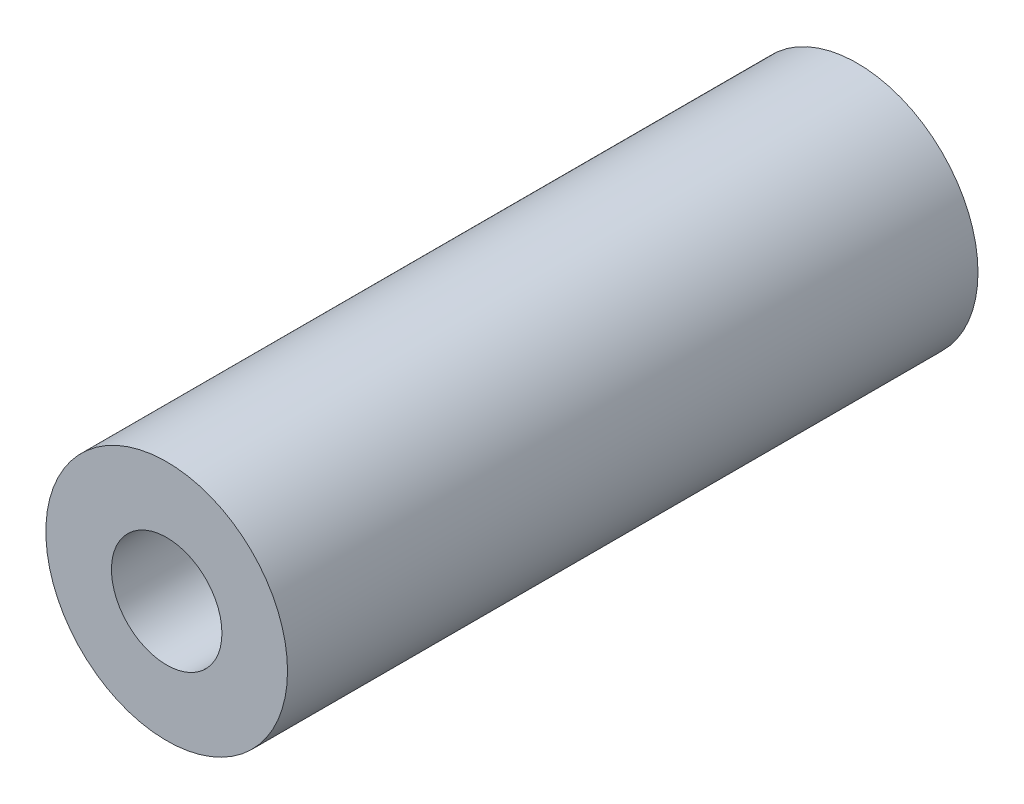
ISO-10303-21;
HEADER;
FILE_DESCRIPTION(('STEP AP214'),'2;1');
FILE_NAME('part.step','',(''),(''),'','','');
FILE_SCHEMA(('AUTOMOTIVE_DESIGN { 1 0 10303 214 1 1 1 1 }'));
ENDSEC;
DATA;
#1=APPLICATION_CONTEXT('core data for automotive mechanical design processes');
#2=APPLICATION_PROTOCOL_DEFINITION('international standard','automotive_design',2000,#1);
#3=PRODUCT_CONTEXT('',#1,'mechanical');
#4=PRODUCT('Part','Part','',(#3));
#5=PRODUCT_RELATED_PRODUCT_CATEGORY('part','',(#4));
#6=PRODUCT_DEFINITION_FORMATION('','',#4);
#7=PRODUCT_DEFINITION_CONTEXT('part definition',#1,'design');
#8=PRODUCT_DEFINITION('design','',#6,#7);
#9=PRODUCT_DEFINITION_SHAPE('','',#8);
#10=(LENGTH_UNIT() NAMED_UNIT(*) SI_UNIT(.MILLI.,.METRE.));
#11=(NAMED_UNIT(*) PLANE_ANGLE_UNIT() SI_UNIT($,.RADIAN.));
#12=(NAMED_UNIT(*) SI_UNIT($,.STERADIAN.) SOLID_ANGLE_UNIT());
#13=UNCERTAINTY_MEASURE_WITH_UNIT(LENGTH_MEASURE(1.E-05),#10,'distance_accuracy_value','');
#14=(GEOMETRIC_REPRESENTATION_CONTEXT(3) GLOBAL_UNCERTAINTY_ASSIGNED_CONTEXT((#13)) GLOBAL_UNIT_ASSIGNED_CONTEXT((#10,
#11,#12)) REPRESENTATION_CONTEXT('',''));
#15=CARTESIAN_POINT('',(0.,0.,0.));
#16=DIRECTION('',(0.,0.,1.));
#17=DIRECTION('',(1.,0.,0.));
#18=AXIS2_PLACEMENT_3D('',#15,#16,#17);
#19=CARTESIAN_POINT('',(0.,0.,20.));
#20=DIRECTION('',(0.,0.,1.));
#21=DIRECTION('',(1.,0.,0.));
#22=AXIS2_PLACEMENT_3D('',#19,#20,#21);
#23=PLANE('',#22);
#24=CARTESIAN_POINT('',(0.,0.,20.));
#25=DIRECTION('',(0.,0.,1.));
#26=DIRECTION('',(1.,0.,0.));
#27=AXIS2_PLACEMENT_3D('',#24,#25,#26);
#28=CIRCLE('',#27,3.5);
#29=CARTESIAN_POINT('',(3.5,0.,20.));
#30=VERTEX_POINT('',#29);
#31=EDGE_CURVE('E10',#30,#30,#28,.T.);
#32=ORIENTED_EDGE('',*,*,#31,.T.);
#33=EDGE_LOOP('',(#32));
#34=FACE_BOUND('',#33,.T.);
#35=CARTESIAN_POINT('',(0.,0.,20.));
#36=DIRECTION('',(0.,0.,1.));
#37=DIRECTION('',(1.,0.,0.));
#38=AXIS2_PLACEMENT_3D('',#35,#36,#37);
#39=CIRCLE('',#38,1.6);
#40=CARTESIAN_POINT('',(1.6,0.,20.));
#41=VERTEX_POINT('',#40);
#42=EDGE_CURVE('E48',#41,#41,#39,.T.);
#43=ORIENTED_EDGE('',*,*,#42,.F.);
#44=EDGE_LOOP('',(#43));
#45=FACE_BOUND('',#44,.T.);
#46=ADVANCED_FACE('F40',(#34,#45),#23,.T.);
#47=CARTESIAN_POINT('',(0.,0.,0.));
#48=DIRECTION('',(0.,0.,1.));
#49=DIRECTION('',(1.,0.,0.));
#50=AXIS2_PLACEMENT_3D('',#47,#48,#49);
#51=PLANE('',#50);
#52=CARTESIAN_POINT('',(0.,0.,0.));
#53=DIRECTION('',(0.,0.,1.));
#54=DIRECTION('',(1.,0.,0.));
#55=AXIS2_PLACEMENT_3D('',#52,#53,#54);
#56=CIRCLE('',#55,3.5);
#57=CARTESIAN_POINT('',(3.5,0.,0.));
#58=VERTEX_POINT('',#57);
#59=EDGE_CURVE('E41',#58,#58,#56,.T.);
#60=ORIENTED_EDGE('',*,*,#59,.F.);
#61=EDGE_LOOP('',(#60));
#62=FACE_BOUND('',#61,.T.);
#63=CARTESIAN_POINT('',(0.,0.,0.));
#64=DIRECTION('',(0.,0.,1.));
#65=DIRECTION('',(1.,0.,0.));
#66=AXIS2_PLACEMENT_3D('',#63,#64,#65);
#67=CIRCLE('',#66,1.6);
#68=CARTESIAN_POINT('',(1.6,0.,0.));
#69=VERTEX_POINT('',#68);
#70=EDGE_CURVE('E49',#69,#69,#67,.T.);
#71=ORIENTED_EDGE('',*,*,#70,.T.);
#72=EDGE_LOOP('',(#71));
#73=FACE_BOUND('',#72,.T.);
#74=ADVANCED_FACE('F58',(#62,#73),#51,.F.);
#75=CARTESIAN_POINT('',(0.,0.,20.));
#76=DIRECTION('',(0.,0.,-1.));
#77=DIRECTION('',(-1.,0.,0.));
#78=AXIS2_PLACEMENT_3D('',#75,#76,#77);
#79=CYLINDRICAL_SURFACE('',#78,3.5);
#80=ORIENTED_EDGE('',*,*,#31,.F.);
#81=EDGE_LOOP('',(#80));
#82=FACE_BOUND('',#81,.T.);
#83=ORIENTED_EDGE('',*,*,#59,.T.);
#84=EDGE_LOOP('',(#83));
#85=FACE_BOUND('',#84,.T.);
#86=ADVANCED_FACE('F39',(#82,#85),#79,.T.);
#87=CARTESIAN_POINT('',(0.,0.,20.));
#88=DIRECTION('',(0.,0.,-1.));
#89=DIRECTION('',(-1.,0.,0.));
#90=AXIS2_PLACEMENT_3D('',#87,#88,#89);
#91=CYLINDRICAL_SURFACE('',#90,1.6);
#92=ORIENTED_EDGE('',*,*,#42,.T.);
#93=EDGE_LOOP('',(#92));
#94=FACE_BOUND('',#93,.T.);
#95=ORIENTED_EDGE('',*,*,#70,.F.);
#96=EDGE_LOOP('',(#95));
#97=FACE_BOUND('',#96,.T.);
#98=ADVANCED_FACE('F57',(#94,#97),#91,.F.);
#99=CLOSED_SHELL('',(#46,#74,#86,#98));
#100=MANIFOLD_SOLID_BREP('B2',#99);
#101=ADVANCED_BREP_SHAPE_REPRESENTATION('',(#18,#100),#14);
#102=SHAPE_DEFINITION_REPRESENTATION(#9,#101);
ENDSEC;
END-ISO-10303-21;
